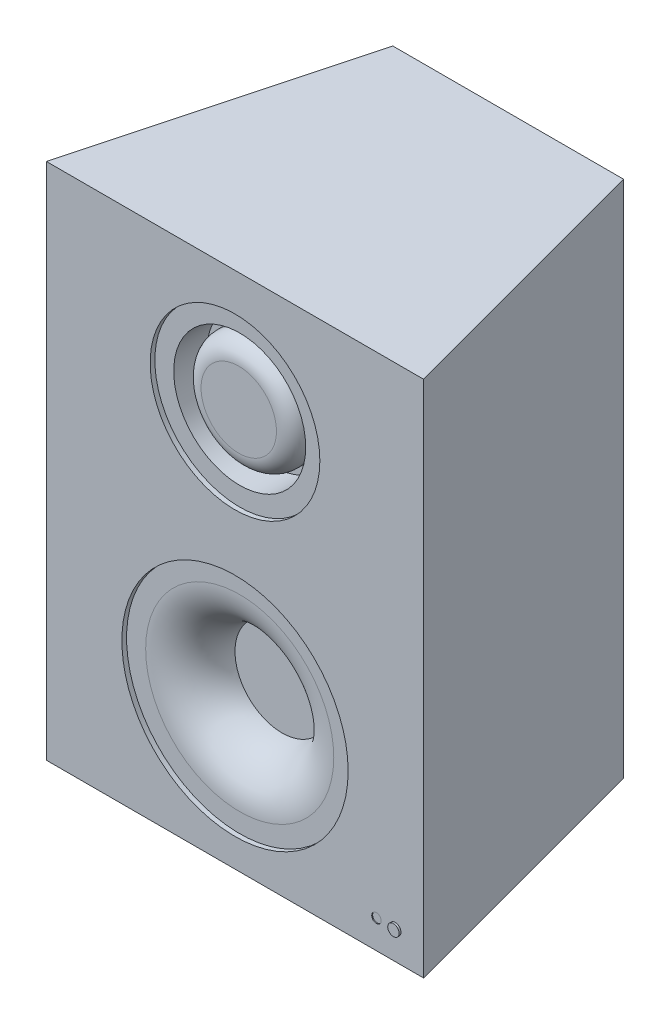
ISO-10303-21;
HEADER;
FILE_DESCRIPTION(('STEP AP214'),'2;1');
FILE_NAME('part.step','',(''),(''),'','','');
FILE_SCHEMA(('AUTOMOTIVE_DESIGN { 1 0 10303 214 1 1 1 1 }'));
ENDSEC;
DATA;
#1=APPLICATION_CONTEXT('core data for automotive mechanical design processes');
#2=APPLICATION_PROTOCOL_DEFINITION('international standard','automotive_design',2000,#1);
#3=PRODUCT_CONTEXT('',#1,'mechanical');
#4=PRODUCT('Part','Part','',(#3));
#5=PRODUCT_RELATED_PRODUCT_CATEGORY('part','',(#4));
#6=PRODUCT_DEFINITION_FORMATION('','',#4);
#7=PRODUCT_DEFINITION_CONTEXT('part definition',#1,'design');
#8=PRODUCT_DEFINITION('design','',#6,#7);
#9=PRODUCT_DEFINITION_SHAPE('','',#8);
#10=(LENGTH_UNIT() NAMED_UNIT(*) SI_UNIT(.MILLI.,.METRE.));
#11=(NAMED_UNIT(*) PLANE_ANGLE_UNIT() SI_UNIT($,.RADIAN.));
#12=(NAMED_UNIT(*) SI_UNIT($,.STERADIAN.) SOLID_ANGLE_UNIT());
#13=UNCERTAINTY_MEASURE_WITH_UNIT(LENGTH_MEASURE(1.E-05),#10,'distance_accuracy_value','');
#14=(GEOMETRIC_REPRESENTATION_CONTEXT(3) GLOBAL_UNCERTAINTY_ASSIGNED_CONTEXT((#13)) GLOBAL_UNIT_ASSIGNED_CONTEXT((#10,
#11,#12)) REPRESENTATION_CONTEXT('',''));
#15=CARTESIAN_POINT('',(0.,0.,0.));
#16=DIRECTION('',(0.,0.,1.));
#17=DIRECTION('',(1.,0.,0.));
#18=AXIS2_PLACEMENT_3D('',#15,#16,#17);
#19=CARTESIAN_POINT('',(-6.79287407103812E-05,71.5878581925393,7.07197799326677));
#20=DIRECTION('',(0.,0.,1.));
#21=DIRECTION('',(1.,0.,0.));
#22=AXIS2_PLACEMENT_3D('',#19,#20,#21);
#23=CYLINDRICAL_SURFACE('',#22,15.24);
#24=CARTESIAN_POINT('',(-6.79287407103812E-05,71.5878581925393,11.1359779932668));
#25=DIRECTION('',(0.,0.,1.));
#26=DIRECTION('',(1.,0.,0.));
#27=AXIS2_PLACEMENT_3D('',#24,#25,#26);
#28=CIRCLE('',#27,15.24);
#29=CARTESIAN_POINT('',(15.2399320712593,71.5878581925393,11.1359779932668));
#30=VERTEX_POINT('',#29);
#31=EDGE_CURVE('E152',#30,#30,#28,.F.);
#32=ORIENTED_EDGE('',*,*,#31,.T.);
#33=EDGE_LOOP('',(#32));
#34=FACE_BOUND('',#33,.T.);
#35=CARTESIAN_POINT('',(-6.79287407103812E-05,71.5878581925393,7.07197799326677));
#36=DIRECTION('',(0.,0.,1.));
#37=DIRECTION('',(1.,0.,0.));
#38=AXIS2_PLACEMENT_3D('',#35,#36,#37);
#39=CIRCLE('',#38,15.24);
#40=CARTESIAN_POINT('',(15.2399320712593,71.5878581925393,7.07197799326677));
#41=VERTEX_POINT('',#40);
#42=EDGE_CURVE('E180',#41,#41,#39,.T.);
#43=ORIENTED_EDGE('',*,*,#42,.T.);
#44=EDGE_LOOP('',(#43));
#45=FACE_BOUND('',#44,.T.);
#46=ADVANCED_FACE('F71',(#34,#45),#23,.T.);
#47=CARTESIAN_POINT('',(31.0779208344474,104.607858192539,-56.3715699699603));
#48=DIRECTION('',(-0.965925826289069,0.,0.258819045102518));
#49=DIRECTION('',(0.258819045102518,0.,0.965925826289069));
#50=AXIS2_PLACEMENT_3D('',#47,#48,#49);
#51=PLANE('',#50);
#52=DIRECTION('',(-0.258819045102518,0.,-0.965925826289069));
#53=VECTOR('',#52,1.);
#54=CARTESIAN_POINT('',(31.0779208344474,-35.0921418074606,-56.3715699699603));
#55=LINE('',#54,#53);
#56=CARTESIAN_POINT('',(50.7999320712593,-35.0921418074606,17.2319779932668));
#57=VERTEX_POINT('',#56);
#58=CARTESIAN_POINT('',(31.0779208344474,-35.0921418074606,-56.3715699699603));
#59=VERTEX_POINT('',#58);
#60=EDGE_CURVE('E139',#57,#59,#55,.T.);
#61=ORIENTED_EDGE('',*,*,#60,.T.);
#62=DIRECTION('',(0.,-1.,0.));
#63=VECTOR('',#62,1.);
#64=CARTESIAN_POINT('',(31.0779208344474,104.607858192539,-56.3715699699603));
#65=LINE('',#64,#63);
#66=CARTESIAN_POINT('',(31.0779208344474,104.607858192539,-56.3715699699603));
#67=VERTEX_POINT('',#66);
#68=EDGE_CURVE('E130',#67,#59,#65,.T.);
#69=ORIENTED_EDGE('',*,*,#68,.F.);
#70=DIRECTION('',(-0.258819045102518,0.,-0.965925826289069));
#71=VECTOR('',#70,1.);
#72=CARTESIAN_POINT('',(31.0779208344474,104.607858192539,-56.3715699699603));
#73=LINE('',#72,#71);
#74=CARTESIAN_POINT('',(50.7999320712593,104.607858192539,17.2319779932668));
#75=VERTEX_POINT('',#74);
#76=EDGE_CURVE('E124',#75,#67,#73,.T.);
#77=ORIENTED_EDGE('',*,*,#76,.F.);
#78=DIRECTION('',(0.,-1.,0.));
#79=VECTOR('',#78,1.);
#80=CARTESIAN_POINT('',(50.7999320712593,104.607858192539,17.2319779932668));
#81=LINE('',#80,#79);
#82=EDGE_CURVE('E135',#75,#57,#81,.T.);
#83=ORIENTED_EDGE('',*,*,#82,.T.);
#84=EDGE_LOOP('',(#61,#69,#77,#83));
#85=FACE_BOUND('',#84,.T.);
#86=ADVANCED_FACE('F213',(#85),#51,.F.);
#87=CARTESIAN_POINT('',(-31.0780566919289,104.607858192539,-56.3715699699603));
#88=DIRECTION('',(0.,0.,1.));
#89=DIRECTION('',(1.,0.,0.));
#90=AXIS2_PLACEMENT_3D('',#87,#88,#89);
#91=PLANE('',#90);
#92=DIRECTION('',(-1.,0.,0.));
#93=VECTOR('',#92,1.);
#94=CARTESIAN_POINT('',(-31.0780566919289,-35.0921418074606,-56.3715699699603));
#95=LINE('',#94,#93);
#96=CARTESIAN_POINT('',(-31.0780566919289,-35.0921418074606,-56.3715699699603));
#97=VERTEX_POINT('',#96);
#98=EDGE_CURVE('E129',#59,#97,#95,.T.);
#99=ORIENTED_EDGE('',*,*,#98,.T.);
#100=DIRECTION('',(0.,-1.,0.));
#101=VECTOR('',#100,1.);
#102=CARTESIAN_POINT('',(-31.0780566919289,104.607858192539,-56.3715699699603));
#103=LINE('',#102,#101);
#104=CARTESIAN_POINT('',(-31.0780566919289,104.607858192539,-56.3715699699603));
#105=VERTEX_POINT('',#104);
#106=EDGE_CURVE('E127',#105,#97,#103,.T.);
#107=ORIENTED_EDGE('',*,*,#106,.F.);
#108=DIRECTION('',(-1.,0.,0.));
#109=VECTOR('',#108,1.);
#110=CARTESIAN_POINT('',(-31.0780566919289,104.607858192539,-56.3715699699603));
#111=LINE('',#110,#109);
#112=EDGE_CURVE('E119',#67,#105,#111,.T.);
#113=ORIENTED_EDGE('',*,*,#112,.F.);
#114=ORIENTED_EDGE('',*,*,#68,.T.);
#115=EDGE_LOOP('',(#99,#107,#113,#114));
#116=FACE_BOUND('',#115,.T.);
#117=ADVANCED_FACE('F128',(#116),#91,.F.);
#118=CARTESIAN_POINT('',(-50.8000679287407,104.607858192539,17.2319779932668));
#119=DIRECTION('',(0.965925826289069,0.,0.258819045102518));
#120=DIRECTION('',(0.258819045102518,0.,-0.965925826289069));
#121=AXIS2_PLACEMENT_3D('',#118,#119,#120);
#122=PLANE('',#121);
#123=DIRECTION('',(-0.258819045102518,0.,0.965925826289069));
#124=VECTOR('',#123,1.);
#125=CARTESIAN_POINT('',(-50.8000679287407,-35.0921418074606,17.2319779932668));
#126=LINE('',#125,#124);
#127=CARTESIAN_POINT('',(-50.8000679287407,-35.0921418074606,17.2319779932668));
#128=VERTEX_POINT('',#127);
#129=EDGE_CURVE('E105',#97,#128,#126,.T.);
#130=ORIENTED_EDGE('',*,*,#129,.T.);
#131=DIRECTION('',(0.,-1.,0.));
#132=VECTOR('',#131,1.);
#133=CARTESIAN_POINT('',(-50.8000679287407,104.607858192539,17.2319779932668));
#134=LINE('',#133,#132);
#135=CARTESIAN_POINT('',(-50.8000679287407,104.607858192539,17.2319779932668));
#136=VERTEX_POINT('',#135);
#137=EDGE_CURVE('E131',#136,#128,#134,.T.);
#138=ORIENTED_EDGE('',*,*,#137,.F.);
#139=DIRECTION('',(-0.258819045102518,0.,0.965925826289069));
#140=VECTOR('',#139,1.);
#141=CARTESIAN_POINT('',(-50.8000679287407,104.607858192539,17.2319779932668));
#142=LINE('',#141,#140);
#143=EDGE_CURVE('E122',#105,#136,#142,.T.);
#144=ORIENTED_EDGE('',*,*,#143,.F.);
#145=ORIENTED_EDGE('',*,*,#106,.T.);
#146=EDGE_LOOP('',(#130,#138,#144,#145));
#147=FACE_BOUND('',#146,.T.);
#148=ADVANCED_FACE('F133',(#147),#122,.F.);
#149=CARTESIAN_POINT('',(-50.8000679287407,104.607858192539,17.2319779932668));
#150=DIRECTION('',(0.,0.,-1.));
#151=DIRECTION('',(-1.,0.,0.));
#152=AXIS2_PLACEMENT_3D('',#149,#150,#151);
#153=PLANE('',#152);
#154=CARTESIAN_POINT('',(38.0999320712593,-27.4721418074606,17.2319779932668));
#155=DIRECTION('',(0.,0.,1.));
#156=DIRECTION('',(1.,0.,0.));
#157=AXIS2_PLACEMENT_3D('',#154,#155,#156);
#158=CIRCLE('',#157,1.27);
#159=CARTESIAN_POINT('',(39.3699320712593,-27.4721418074606,17.2319779932668));
#160=VERTEX_POINT('',#159);
#161=EDGE_CURVE('E254',#160,#160,#158,.T.);
#162=ORIENTED_EDGE('',*,*,#161,.F.);
#163=EDGE_LOOP('',(#162));
#164=FACE_BOUND('',#163,.T.);
#165=CARTESIAN_POINT('',(43.1799320712593,-27.4721418074606,17.2319779932668));
#166=DIRECTION('',(0.,0.,-1.));
#167=DIRECTION('',(-1.,0.,0.));
#168=AXIS2_PLACEMENT_3D('',#165,#166,#167);
#169=CIRCLE('',#168,1.52823896610813);
#170=CARTESIAN_POINT('',(41.6516931051512,-27.4721418074606,17.2319779932668));
#171=VERTEX_POINT('',#170);
#172=EDGE_CURVE('E12',#171,#171,#169,.F.);
#173=ORIENTED_EDGE('',*,*,#172,.F.);
#174=EDGE_LOOP('',(#173));
#175=FACE_BOUND('',#174,.T.);
#176=CARTESIAN_POINT('',(-6.79287407103812E-05,3.00785819253936,17.2319779932668));
#177=DIRECTION('',(0.,0.,1.));
#178=DIRECTION('',(1.,0.,0.));
#179=AXIS2_PLACEMENT_3D('',#176,#177,#178);
#180=CIRCLE('',#179,30.48);
#181=CARTESIAN_POINT('',(30.4799320712593,3.00785819253936,17.2319779932668));
#182=VERTEX_POINT('',#181);
#183=EDGE_CURVE('E168',#182,#182,#180,.T.);
#184=ORIENTED_EDGE('',*,*,#183,.F.);
#185=EDGE_LOOP('',(#184));
#186=FACE_BOUND('',#185,.T.);
#187=CARTESIAN_POINT('',(-6.79287407103812E-05,71.5878581925393,17.2319779932668));
#188=DIRECTION('',(0.,0.,1.));
#189=DIRECTION('',(1.,0.,0.));
#190=AXIS2_PLACEMENT_3D('',#187,#188,#189);
#191=CIRCLE('',#190,22.86);
#192=CARTESIAN_POINT('',(22.8599320712593,71.5878581925393,17.2319779932668));
#193=VERTEX_POINT('',#192);
#194=EDGE_CURVE('E190',#193,#193,#191,.T.);
#195=ORIENTED_EDGE('',*,*,#194,.F.);
#196=EDGE_LOOP('',(#195));
#197=FACE_BOUND('',#196,.T.);
#198=DIRECTION('',(1.,0.,0.));
#199=VECTOR('',#198,1.);
#200=CARTESIAN_POINT('',(-50.8000679287407,-35.0921418074606,17.2319779932668));
#201=LINE('',#200,#199);
#202=EDGE_CURVE('E111',#128,#57,#201,.T.);
#203=ORIENTED_EDGE('',*,*,#202,.T.);
#204=ORIENTED_EDGE('',*,*,#82,.F.);
#205=DIRECTION('',(1.,0.,0.));
#206=VECTOR('',#205,1.);
#207=CARTESIAN_POINT('',(-50.8000679287407,104.607858192539,17.2319779932668));
#208=LINE('',#207,#206);
#209=EDGE_CURVE('E88',#136,#75,#208,.T.);
#210=ORIENTED_EDGE('',*,*,#209,.F.);
#211=ORIENTED_EDGE('',*,*,#137,.T.);
#212=EDGE_LOOP('',(#203,#204,#210,#211));
#213=FACE_BOUND('',#212,.T.);
#214=ADVANCED_FACE('F198',(#164,#175,#186,#197,#213),#153,.F.);
#215=CARTESIAN_POINT('',(-6.79287407103812E-05,104.607858192539,17.2319779932668));
#216=DIRECTION('',(0.,1.,0.));
#217=DIRECTION('',(0.,0.,1.));
#218=AXIS2_PLACEMENT_3D('',#215,#216,#217);
#219=PLANE('',#218);
#220=ORIENTED_EDGE('',*,*,#76,.T.);
#221=ORIENTED_EDGE('',*,*,#112,.T.);
#222=ORIENTED_EDGE('',*,*,#143,.T.);
#223=ORIENTED_EDGE('',*,*,#209,.T.);
#224=EDGE_LOOP('',(#220,#221,#222,#223));
#225=FACE_BOUND('',#224,.T.);
#226=ADVANCED_FACE('F120',(#225),#219,.T.);
#227=CARTESIAN_POINT('',(-6.79287407103812E-05,-35.0921418074606,17.2319779932668));
#228=DIRECTION('',(0.,1.,0.));
#229=DIRECTION('',(0.,0.,1.));
#230=AXIS2_PLACEMENT_3D('',#227,#228,#229);
#231=PLANE('',#230);
#232=CARTESIAN_POINT('',(-6.79287407103812E-05,-35.0921418074606,-38.6480220067332));
#233=DIRECTION('',(0.,-1.,0.));
#234=DIRECTION('',(0.,0.,-1.));
#235=AXIS2_PLACEMENT_3D('',#232,#233,#234);
#236=CIRCLE('',#235,6.35);
#237=CARTESIAN_POINT('',(-6.79287407103812E-05,-35.0921418074606,-44.9980220067332));
#238=VERTEX_POINT('',#237);
#239=EDGE_CURVE('E248',#238,#238,#236,.T.);
#240=ORIENTED_EDGE('',*,*,#239,.F.);
#241=EDGE_LOOP('',(#240));
#242=FACE_BOUND('',#241,.T.);
#243=ORIENTED_EDGE('',*,*,#60,.F.);
#244=ORIENTED_EDGE('',*,*,#202,.F.);
#245=ORIENTED_EDGE('',*,*,#129,.F.);
#246=ORIENTED_EDGE('',*,*,#98,.F.);
#247=EDGE_LOOP('',(#243,#244,#245,#246));
#248=FACE_BOUND('',#247,.T.);
#249=ADVANCED_FACE('F206',(#242,#248),#231,.F.);
#250=CARTESIAN_POINT('',(-6.79287407103812E-05,71.5878581925393,15.9619779932668));
#251=DIRECTION('',(0.,0.,1.));
#252=DIRECTION('',(1.,0.,0.));
#253=AXIS2_PLACEMENT_3D('',#250,#251,#252);
#254=CYLINDRICAL_SURFACE('',#253,22.86);
#255=CARTESIAN_POINT('',(-6.79287407103812E-05,71.5878581925393,15.9619779932668));
#256=DIRECTION('',(0.,0.,1.));
#257=DIRECTION('',(1.,0.,0.));
#258=AXIS2_PLACEMENT_3D('',#255,#256,#257);
#259=CIRCLE('',#258,22.86);
#260=CARTESIAN_POINT('',(22.8599320712593,71.5878581925393,15.9619779932668));
#261=VERTEX_POINT('',#260);
#262=EDGE_CURVE('E142',#261,#261,#259,.T.);
#263=ORIENTED_EDGE('',*,*,#262,.F.);
#264=EDGE_LOOP('',(#263));
#265=FACE_BOUND('',#264,.T.);
#266=ORIENTED_EDGE('',*,*,#194,.T.);
#267=EDGE_LOOP('',(#266));
#268=FACE_BOUND('',#267,.T.);
#269=ADVANCED_FACE('F196',(#265,#268),#254,.F.);
#270=CARTESIAN_POINT('',(-6.79287407103812E-05,71.5878581925393,15.9619779932668));
#271=DIRECTION('',(0.,0.,1.));
#272=DIRECTION('',(1.,0.,0.));
#273=AXIS2_PLACEMENT_3D('',#270,#271,#272);
#274=PLANE('',#273);
#275=CARTESIAN_POINT('',(-6.79287407103812E-05,71.5878581925393,15.9619779932668));
#276=DIRECTION('',(0.,0.,1.));
#277=DIRECTION('',(1.,0.,0.));
#278=AXIS2_PLACEMENT_3D('',#275,#276,#277);
#279=CIRCLE('',#278,17.78);
#280=CARTESIAN_POINT('',(17.7799320712593,71.5878581925393,15.9619779932668));
#281=VERTEX_POINT('',#280);
#282=EDGE_CURVE('E187',#281,#281,#279,.T.);
#283=ORIENTED_EDGE('',*,*,#282,.F.);
#284=EDGE_LOOP('',(#283));
#285=FACE_BOUND('',#284,.T.);
#286=ORIENTED_EDGE('',*,*,#262,.T.);
#287=EDGE_LOOP('',(#286));
#288=FACE_BOUND('',#287,.T.);
#289=ADVANCED_FACE('F234',(#285,#288),#274,.T.);
#290=CARTESIAN_POINT('',(-6.79287407103812E-05,71.5878581925393,7.07197799326677));
#291=DIRECTION('',(0.,0.,1.));
#292=DIRECTION('',(1.,0.,0.));
#293=AXIS2_PLACEMENT_3D('',#290,#291,#292);
#294=CYLINDRICAL_SURFACE('',#293,17.78);
#295=ORIENTED_EDGE('',*,*,#282,.T.);
#296=EDGE_LOOP('',(#295));
#297=FACE_BOUND('',#296,.T.);
#298=CARTESIAN_POINT('',(-6.79287407103812E-05,71.5878581925393,7.07197799326677));
#299=DIRECTION('',(0.,0.,1.));
#300=DIRECTION('',(1.,0.,0.));
#301=AXIS2_PLACEMENT_3D('',#298,#299,#300);
#302=CIRCLE('',#301,17.78);
#303=CARTESIAN_POINT('',(17.7799320712593,71.5878581925393,7.07197799326677));
#304=VERTEX_POINT('',#303);
#305=EDGE_CURVE('E184',#304,#304,#302,.T.);
#306=ORIENTED_EDGE('',*,*,#305,.F.);
#307=EDGE_LOOP('',(#306));
#308=FACE_BOUND('',#307,.T.);
#309=ADVANCED_FACE('F230',(#297,#308),#294,.F.);
#310=CARTESIAN_POINT('',(-6.79287407103812E-05,71.5878581925393,7.07197799326677));
#311=DIRECTION('',(0.,0.,1.));
#312=DIRECTION('',(1.,0.,0.));
#313=AXIS2_PLACEMENT_3D('',#310,#311,#312);
#314=PLANE('',#313);
#315=ORIENTED_EDGE('',*,*,#42,.F.);
#316=EDGE_LOOP('',(#315));
#317=FACE_BOUND('',#316,.T.);
#318=ORIENTED_EDGE('',*,*,#305,.T.);
#319=EDGE_LOOP('',(#318));
#320=FACE_BOUND('',#319,.T.);
#321=ADVANCED_FACE('F227',(#317,#320),#314,.T.);
#322=CARTESIAN_POINT('',(-6.79287407103812E-05,71.5878581925393,16.2159779932668));
#323=DIRECTION('',(0.,0.,1.));
#324=DIRECTION('',(1.,0.,0.));
#325=AXIS2_PLACEMENT_3D('',#322,#323,#324);
#326=PLANE('',#325);
#327=CARTESIAN_POINT('',(-6.79287407103812E-05,71.5878581925393,16.2159779932668));
#328=DIRECTION('',(0.,0.,1.));
#329=DIRECTION('',(1.,0.,0.));
#330=AXIS2_PLACEMENT_3D('',#327,#328,#329);
#331=CIRCLE('',#330,10.16);
#332=CARTESIAN_POINT('',(10.1599320712593,71.5878581925393,16.2159779932668));
#333=VERTEX_POINT('',#332);
#334=EDGE_CURVE('E149',#333,#333,#331,.T.);
#335=ORIENTED_EDGE('',*,*,#334,.T.);
#336=EDGE_LOOP('',(#335));
#337=FACE_BOUND('',#336,.T.);
#338=ADVANCED_FACE('F225',(#337),#326,.T.);
#339=CARTESIAN_POINT('',(-6.79287407103812E-05,71.5878581925393,11.1359779932668));
#340=DIRECTION('',(0.,0.,1.));
#341=DIRECTION('',(1.,0.,0.));
#342=AXIS2_PLACEMENT_3D('',#339,#340,#341);
#343=TOROIDAL_SURFACE('',#342,10.16,5.08);
#344=ORIENTED_EDGE('',*,*,#31,.F.);
#345=EDGE_LOOP('',(#344));
#346=FACE_BOUND('',#345,.T.);
#347=ORIENTED_EDGE('',*,*,#334,.F.);
#348=EDGE_LOOP('',(#347));
#349=FACE_BOUND('',#348,.T.);
#350=ADVANCED_FACE('F286',(#346,#349),#343,.T.);
#351=CARTESIAN_POINT('',(-6.79287407103812E-05,3.00785819253936,15.9619779932668));
#352=DIRECTION('',(0.,0.,1.));
#353=DIRECTION('',(1.,0.,0.));
#354=AXIS2_PLACEMENT_3D('',#351,#352,#353);
#355=CYLINDRICAL_SURFACE('',#354,30.48);
#356=CARTESIAN_POINT('',(-6.79287407103812E-05,3.00785819253936,15.9619779932668));
#357=DIRECTION('',(0.,0.,1.));
#358=DIRECTION('',(1.,0.,0.));
#359=AXIS2_PLACEMENT_3D('',#356,#357,#358);
#360=CIRCLE('',#359,30.48);
#361=CARTESIAN_POINT('',(30.4799320712593,3.00785819253936,15.9619779932668));
#362=VERTEX_POINT('',#361);
#363=EDGE_CURVE('E172',#362,#362,#360,.T.);
#364=ORIENTED_EDGE('',*,*,#363,.F.);
#365=EDGE_LOOP('',(#364));
#366=FACE_BOUND('',#365,.T.);
#367=ORIENTED_EDGE('',*,*,#183,.T.);
#368=EDGE_LOOP('',(#367));
#369=FACE_BOUND('',#368,.T.);
#370=ADVANCED_FACE('F284',(#366,#369),#355,.F.);
#371=CARTESIAN_POINT('',(-6.79287407103812E-05,3.00785819253936,15.9619779932668));
#372=DIRECTION('',(0.,0.,1.));
#373=DIRECTION('',(1.,0.,0.));
#374=AXIS2_PLACEMENT_3D('',#371,#372,#373);
#375=PLANE('',#374);
#376=CARTESIAN_POINT('',(-6.79287407103812E-05,3.00785819253936,15.9619779932668));
#377=DIRECTION('',(0.,0.,1.));
#378=DIRECTION('',(1.,0.,0.));
#379=AXIS2_PLACEMENT_3D('',#376,#377,#378);
#380=CIRCLE('',#379,25.3363404512541);
#381=CARTESIAN_POINT('',(25.3362725225134,3.00785819253936,15.9619779932668));
#382=VERTEX_POINT('',#381);
#383=EDGE_CURVE('E80',#382,#382,#380,.F.);
#384=ORIENTED_EDGE('',*,*,#383,.T.);
#385=EDGE_LOOP('',(#384));
#386=FACE_BOUND('',#385,.T.);
#387=ORIENTED_EDGE('',*,*,#363,.T.);
#388=EDGE_LOOP('',(#387));
#389=FACE_BOUND('',#388,.T.);
#390=ADVANCED_FACE('F157',(#386,#389),#375,.T.);
#391=CARTESIAN_POINT('',(-6.79287407103812E-05,3.00785819253936,4.53197799326677));
#392=DIRECTION('',(0.,0.,1.));
#393=DIRECTION('',(1.,0.,0.));
#394=AXIS2_PLACEMENT_3D('',#391,#392,#393);
#395=PLANE('',#394);
#396=CARTESIAN_POINT('',(-6.79287407103812E-05,3.00785819253936,4.53197799326677));
#397=DIRECTION('',(0.,0.,1.));
#398=DIRECTION('',(1.,0.,0.));
#399=AXIS2_PLACEMENT_3D('',#396,#397,#398);
#400=CIRCLE('',#399,12.7);
#401=CARTESIAN_POINT('',(12.6999320712593,3.00785819253936,4.53197799326677));
#402=VERTEX_POINT('',#401);
#403=EDGE_CURVE('E166',#402,#402,#400,.T.);
#404=ORIENTED_EDGE('',*,*,#403,.T.);
#405=EDGE_LOOP('',(#404));
#406=FACE_BOUND('',#405,.T.);
#407=ADVANCED_FACE('F163',(#406),#395,.T.);
#408=CARTESIAN_POINT('',(-6.79287407103812E-05,3.00785819253936,3.26197799326677));
#409=DIRECTION('',(0.,0.,1.));
#410=DIRECTION('',(1.,0.,0.));
#411=AXIS2_PLACEMENT_3D('',#408,#409,#410);
#412=TOROIDAL_SURFACE('',#411,25.3363404512541,12.7);
#413=ORIENTED_EDGE('',*,*,#383,.F.);
#414=EDGE_LOOP('',(#413));
#415=FACE_BOUND('',#414,.T.);
#416=ORIENTED_EDGE('',*,*,#403,.F.);
#417=EDGE_LOOP('',(#416));
#418=FACE_BOUND('',#417,.T.);
#419=ADVANCED_FACE('F73',(#415,#418),#412,.T.);
#420=CARTESIAN_POINT('',(43.1799320712593,-27.4721418074606,17.7399779932668));
#421=DIRECTION('',(0.,0.,-1.));
#422=DIRECTION('',(-1.,0.,0.));
#423=AXIS2_PLACEMENT_3D('',#420,#421,#422);
#424=CYLINDRICAL_SURFACE('',#423,1.52823896610813);
#425=CARTESIAN_POINT('',(43.1799320712593,-27.4721418074606,17.7399779932668));
#426=DIRECTION('',(0.,0.,1.));
#427=DIRECTION('',(1.,0.,0.));
#428=AXIS2_PLACEMENT_3D('',#425,#426,#427);
#429=CIRCLE('',#428,1.52823896610813);
#430=CARTESIAN_POINT('',(44.7081710373674,-27.4721418074606,17.7399779932668));
#431=VERTEX_POINT('',#430);
#432=EDGE_CURVE('E169',#431,#431,#429,.T.);
#433=ORIENTED_EDGE('',*,*,#432,.F.);
#434=EDGE_LOOP('',(#433));
#435=FACE_BOUND('',#434,.T.);
#436=ORIENTED_EDGE('',*,*,#172,.T.);
#437=EDGE_LOOP('',(#436));
#438=FACE_BOUND('',#437,.T.);
#439=ADVANCED_FACE('F162',(#435,#438),#424,.T.);
#440=CARTESIAN_POINT('',(43.1799320712593,-27.4721418074606,17.7399779932668));
#441=DIRECTION('',(0.,0.,1.));
#442=DIRECTION('',(1.,0.,0.));
#443=AXIS2_PLACEMENT_3D('',#440,#441,#442);
#444=PLANE('',#443);
#445=ORIENTED_EDGE('',*,*,#432,.T.);
#446=EDGE_LOOP('',(#445));
#447=FACE_BOUND('',#446,.T.);
#448=ADVANCED_FACE('F263',(#447),#444,.T.);
#449=CARTESIAN_POINT('',(38.0999320712593,-27.4721418074606,16.9779779932668));
#450=DIRECTION('',(0.,0.,1.));
#451=DIRECTION('',(1.,0.,0.));
#452=AXIS2_PLACEMENT_3D('',#449,#450,#451);
#453=CYLINDRICAL_SURFACE('',#452,1.27);
#454=CARTESIAN_POINT('',(38.0999320712593,-27.4721418074606,16.9779779932668));
#455=DIRECTION('',(0.,0.,1.));
#456=DIRECTION('',(1.,0.,0.));
#457=AXIS2_PLACEMENT_3D('',#454,#455,#456);
#458=CIRCLE('',#457,1.27);
#459=CARTESIAN_POINT('',(39.3699320712593,-27.4721418074606,16.9779779932668));
#460=VERTEX_POINT('',#459);
#461=EDGE_CURVE('E175',#460,#460,#458,.T.);
#462=ORIENTED_EDGE('',*,*,#461,.F.);
#463=EDGE_LOOP('',(#462));
#464=FACE_BOUND('',#463,.T.);
#465=ORIENTED_EDGE('',*,*,#161,.T.);
#466=EDGE_LOOP('',(#465));
#467=FACE_BOUND('',#466,.T.);
#468=ADVANCED_FACE('F260',(#464,#467),#453,.F.);
#469=CARTESIAN_POINT('',(38.0999320712593,-27.4721418074606,16.9779779932668));
#470=DIRECTION('',(0.,0.,1.));
#471=DIRECTION('',(1.,0.,0.));
#472=AXIS2_PLACEMENT_3D('',#469,#470,#471);
#473=PLANE('',#472);
#474=ORIENTED_EDGE('',*,*,#461,.T.);
#475=EDGE_LOOP('',(#474));
#476=FACE_BOUND('',#475,.T.);
#477=ADVANCED_FACE('F262',(#476),#473,.T.);
#478=CARTESIAN_POINT('',(-6.79287407103812E-05,-30.0121418074606,-38.6480220067332));
#479=DIRECTION('',(0.,-1.,0.));
#480=DIRECTION('',(0.,0.,-1.));
#481=AXIS2_PLACEMENT_3D('',#478,#479,#480);
#482=CYLINDRICAL_SURFACE('',#481,6.35);
#483=CARTESIAN_POINT('',(-6.79287407103812E-05,-30.0121418074606,-38.6480220067332));
#484=DIRECTION('',(0.,-1.,0.));
#485=DIRECTION('',(0.,0.,-1.));
#486=AXIS2_PLACEMENT_3D('',#483,#484,#485);
#487=CIRCLE('',#486,6.35);
#488=CARTESIAN_POINT('',(-6.79287407103812E-05,-30.0121418074606,-44.9980220067332));
#489=VERTEX_POINT('',#488);
#490=EDGE_CURVE('E251',#489,#489,#487,.T.);
#491=ORIENTED_EDGE('',*,*,#490,.F.);
#492=EDGE_LOOP('',(#491));
#493=FACE_BOUND('',#492,.T.);
#494=ORIENTED_EDGE('',*,*,#239,.T.);
#495=EDGE_LOOP('',(#494));
#496=FACE_BOUND('',#495,.T.);
#497=ADVANCED_FACE('F270',(#493,#496),#482,.F.);
#498=CARTESIAN_POINT('',(-6.79287407103812E-05,-30.0121418074606,-38.6480220067332));
#499=DIRECTION('',(0.,-1.,0.));
#500=DIRECTION('',(0.,0.,-1.));
#501=AXIS2_PLACEMENT_3D('',#498,#499,#500);
#502=PLANE('',#501);
#503=ORIENTED_EDGE('',*,*,#490,.T.);
#504=EDGE_LOOP('',(#503));
#505=FACE_BOUND('',#504,.T.);
#506=ADVANCED_FACE('F520',(#505),#502,.T.);
#507=CLOSED_SHELL('',(#46,#86,#117,#148,#214,#226,#249,#269,#289,#309,#321,#338,#350,#370,#390,
#407,#419,#439,#448,#468,#477,#497,#506));
#508=MANIFOLD_SOLID_BREP('B2',#507);
#509=ADVANCED_BREP_SHAPE_REPRESENTATION('',(#18,#508),#14);
#510=SHAPE_DEFINITION_REPRESENTATION(#9,#509);
ENDSEC;
END-ISO-10303-21;
